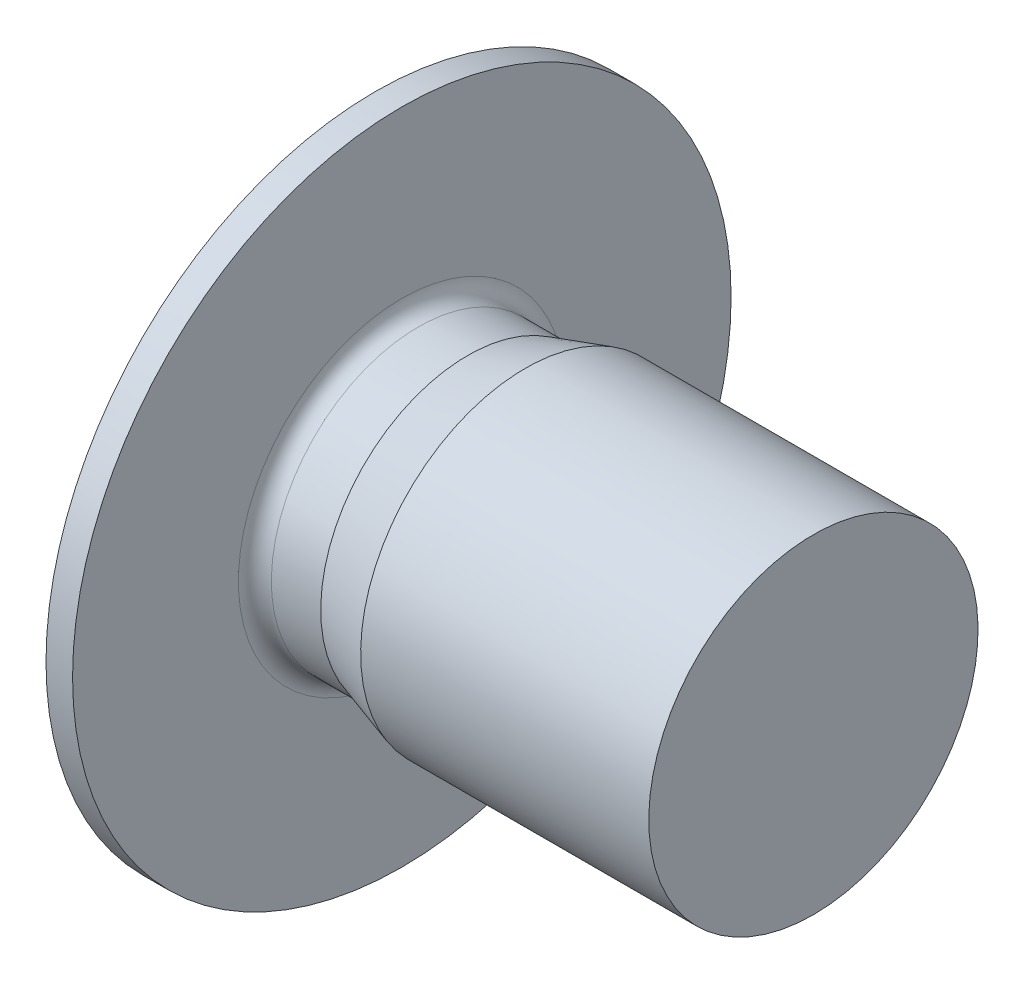
ISO-10303-21;
HEADER;
FILE_DESCRIPTION(('STEP AP214'),'2;1');
FILE_NAME('part.step','',(''),(''),'','','');
FILE_SCHEMA(('AUTOMOTIVE_DESIGN { 1 0 10303 214 1 1 1 1 }'));
ENDSEC;
DATA;
#1=APPLICATION_CONTEXT('core data for automotive mechanical design processes');
#2=APPLICATION_PROTOCOL_DEFINITION('international standard','automotive_design',2000,#1);
#3=PRODUCT_CONTEXT('',#1,'mechanical');
#4=PRODUCT('Part','Part','',(#3));
#5=PRODUCT_RELATED_PRODUCT_CATEGORY('part','',(#4));
#6=PRODUCT_DEFINITION_FORMATION('','',#4);
#7=PRODUCT_DEFINITION_CONTEXT('part definition',#1,'design');
#8=PRODUCT_DEFINITION('design','',#6,#7);
#9=PRODUCT_DEFINITION_SHAPE('','',#8);
#10=(LENGTH_UNIT() NAMED_UNIT(*) SI_UNIT(.MILLI.,.METRE.));
#11=(NAMED_UNIT(*) PLANE_ANGLE_UNIT() SI_UNIT($,.RADIAN.));
#12=(NAMED_UNIT(*) SI_UNIT($,.STERADIAN.) SOLID_ANGLE_UNIT());
#13=UNCERTAINTY_MEASURE_WITH_UNIT(LENGTH_MEASURE(1.E-05),#10,'distance_accuracy_value','');
#14=(GEOMETRIC_REPRESENTATION_CONTEXT(3) GLOBAL_UNCERTAINTY_ASSIGNED_CONTEXT((#13)) GLOBAL_UNIT_ASSIGNED_CONTEXT((#10,
#11,#12)) REPRESENTATION_CONTEXT('',''));
#15=CARTESIAN_POINT('',(0.,0.,0.));
#16=DIRECTION('',(0.,0.,1.));
#17=DIRECTION('',(1.,0.,0.));
#18=AXIS2_PLACEMENT_3D('',#15,#16,#17);
#19=CARTESIAN_POINT('',(1.6,0.,0.));
#20=DIRECTION('',(-1.,0.,0.));
#21=DIRECTION('',(0.,0.,1.));
#22=AXIS2_PLACEMENT_3D('',#19,#20,#21);
#23=PLANE('',#22);
#24=CARTESIAN_POINT('',(1.6,0.,0.));
#25=DIRECTION('',(-1.,0.,0.));
#26=DIRECTION('',(0.,-1.,0.));
#27=AXIS2_PLACEMENT_3D('',#24,#25,#26);
#28=CIRCLE('',#27,1.);
#29=CARTESIAN_POINT('',(1.6,-0.866025403784439,0.5));
#30=VERTEX_POINT('',#29);
#31=CARTESIAN_POINT('',(1.6,0.,1.));
#32=VERTEX_POINT('',#31);
#33=EDGE_CURVE('E50',#30,#32,#28,.T.);
#34=ORIENTED_EDGE('',*,*,#33,.F.);
#35=DIRECTION('',(0.,0.5,0.866025403784439));
#36=VECTOR('',#35,1.);
#37=CARTESIAN_POINT('',(1.6,-1.15470053837925,0.));
#38=LINE('',#37,#36);
#39=CARTESIAN_POINT('',(1.6,-0.577350269189627,1.));
#40=VERTEX_POINT('',#39);
#41=EDGE_CURVE('E265',#30,#40,#38,.T.);
#42=ORIENTED_EDGE('',*,*,#41,.T.);
#43=DIRECTION('',(0.,1.,0.));
#44=VECTOR('',#43,1.);
#45=CARTESIAN_POINT('',(1.6,-0.577350269189627,1.));
#46=LINE('',#45,#44);
#47=EDGE_CURVE('E233',#40,#32,#46,.T.);
#48=ORIENTED_EDGE('',*,*,#47,.T.);
#49=EDGE_LOOP('',(#34,#42,#48));
#50=FACE_BOUND('',#49,.T.);
#51=ADVANCED_FACE('F39',(#50),#23,.T.);
#52=CARTESIAN_POINT('',(1.6,0.866025403784439,0.5));
#53=VERTEX_POINT('',#52);
#54=EDGE_CURVE('E11',#32,#53,#28,.T.);
#55=ORIENTED_EDGE('',*,*,#54,.F.);
#56=CARTESIAN_POINT('',(1.6,0.577350269189626,1.));
#57=VERTEX_POINT('',#56);
#58=EDGE_CURVE('E258',#32,#57,#46,.T.);
#59=ORIENTED_EDGE('',*,*,#58,.T.);
#60=DIRECTION('',(0.,0.5,-0.866025403784439));
#61=VECTOR('',#60,1.);
#62=CARTESIAN_POINT('',(1.6,0.577350269189626,1.));
#63=LINE('',#62,#61);
#64=EDGE_CURVE('E279',#57,#53,#63,.T.);
#65=ORIENTED_EDGE('',*,*,#64,.T.);
#66=EDGE_LOOP('',(#55,#59,#65));
#67=FACE_BOUND('',#66,.T.);
#68=ADVANCED_FACE('F126',(#67),#23,.T.);
#69=CARTESIAN_POINT('',(1.6,0.866025403784439,-0.5));
#70=VERTEX_POINT('',#69);
#71=EDGE_CURVE('E48',#53,#70,#28,.T.);
#72=ORIENTED_EDGE('',*,*,#71,.F.);
#73=CARTESIAN_POINT('',(1.6,1.15470053837925,0.));
#74=VERTEX_POINT('',#73);
#75=EDGE_CURVE('E246',#53,#74,#63,.T.);
#76=ORIENTED_EDGE('',*,*,#75,.T.);
#77=DIRECTION('',(0.,-0.5,-0.866025403784439));
#78=VECTOR('',#77,1.);
#79=CARTESIAN_POINT('',(1.6,1.15470053837925,0.));
#80=LINE('',#79,#78);
#81=EDGE_CURVE('E276',#74,#70,#80,.T.);
#82=ORIENTED_EDGE('',*,*,#81,.T.);
#83=EDGE_LOOP('',(#72,#76,#82));
#84=FACE_BOUND('',#83,.T.);
#85=ADVANCED_FACE('F131',(#84),#23,.T.);
#86=CARTESIAN_POINT('',(1.6,0.,-1.));
#87=VERTEX_POINT('',#86);
#88=EDGE_CURVE('E224',#70,#87,#28,.T.);
#89=ORIENTED_EDGE('',*,*,#88,.F.);
#90=CARTESIAN_POINT('',(1.6,0.577350269189626,-1.));
#91=VERTEX_POINT('',#90);
#92=EDGE_CURVE('E278',#70,#91,#80,.T.);
#93=ORIENTED_EDGE('',*,*,#92,.T.);
#94=DIRECTION('',(0.,-1.,0.));
#95=VECTOR('',#94,1.);
#96=CARTESIAN_POINT('',(1.6,0.577350269189626,-1.));
#97=LINE('',#96,#95);
#98=EDGE_CURVE('E272',#91,#87,#97,.T.);
#99=ORIENTED_EDGE('',*,*,#98,.T.);
#100=EDGE_LOOP('',(#89,#93,#99));
#101=FACE_BOUND('',#100,.T.);
#102=ADVANCED_FACE('F190',(#101),#23,.T.);
#103=CARTESIAN_POINT('',(1.6,-0.866025403784439,-0.5));
#104=VERTEX_POINT('',#103);
#105=EDGE_CURVE('E57',#87,#104,#28,.T.);
#106=ORIENTED_EDGE('',*,*,#105,.F.);
#107=CARTESIAN_POINT('',(1.6,-0.577350269189626,-1.));
#108=VERTEX_POINT('',#107);
#109=EDGE_CURVE('E275',#87,#108,#97,.T.);
#110=ORIENTED_EDGE('',*,*,#109,.T.);
#111=DIRECTION('',(0.,-0.5,0.866025403784438));
#112=VECTOR('',#111,1.);
#113=CARTESIAN_POINT('',(1.6,-0.577350269189626,-1.));
#114=LINE('',#113,#112);
#115=EDGE_CURVE('E267',#108,#104,#114,.T.);
#116=ORIENTED_EDGE('',*,*,#115,.T.);
#117=EDGE_LOOP('',(#106,#110,#116));
#118=FACE_BOUND('',#117,.T.);
#119=ADVANCED_FACE('F124',(#118),#23,.T.);
#120=CARTESIAN_POINT('',(-0.9,0.,0.));
#121=DIRECTION('',(-1.,0.,0.));
#122=DIRECTION('',(0.,-1.,0.));
#123=AXIS2_PLACEMENT_3D('',#120,#121,#122);
#124=CYLINDRICAL_SURFACE('',#123,1.785);
#125=CARTESIAN_POINT('',(0.2,0.,0.));
#126=DIRECTION('',(-1.,0.,0.));
#127=DIRECTION('',(0.,-1.,0.));
#128=AXIS2_PLACEMENT_3D('',#125,#126,#127);
#129=CIRCLE('',#128,1.785);
#130=CARTESIAN_POINT('',(0.2,-1.785,0.));
#131=VERTEX_POINT('',#130);
#132=EDGE_CURVE('E43',#131,#131,#129,.F.);
#133=ORIENTED_EDGE('',*,*,#132,.T.);
#134=EDGE_LOOP('',(#133));
#135=FACE_BOUND('',#134,.T.);
#136=CARTESIAN_POINT('',(0.8,0.,0.));
#137=DIRECTION('',(-1.,0.,0.));
#138=DIRECTION('',(0.,-1.,0.));
#139=AXIS2_PLACEMENT_3D('',#136,#137,#138);
#140=CIRCLE('',#139,1.785);
#141=CARTESIAN_POINT('',(0.8,-1.785,0.));
#142=VERTEX_POINT('',#141);
#143=EDGE_CURVE('E197',#142,#142,#140,.T.);
#144=ORIENTED_EDGE('',*,*,#143,.T.);
#145=EDGE_LOOP('',(#144));
#146=FACE_BOUND('',#145,.T.);
#147=ADVANCED_FACE('F183',(#135,#146),#124,.T.);
#148=CARTESIAN_POINT('',(0.,4.,0.));
#149=DIRECTION('',(-1.,0.,0.));
#150=DIRECTION('',(0.,-1.,0.));
#151=AXIS2_PLACEMENT_3D('',#148,#149,#150);
#152=PLANE('',#151);
#153=CARTESIAN_POINT('',(0.,0.,0.));
#154=DIRECTION('',(-1.,0.,0.));
#155=DIRECTION('',(0.,-1.,0.));
#156=AXIS2_PLACEMENT_3D('',#153,#154,#155);
#157=CIRCLE('',#156,1.985);
#158=CARTESIAN_POINT('',(0.,-1.985,0.));
#159=VERTEX_POINT('',#158);
#160=EDGE_CURVE('E220',#159,#159,#157,.T.);
#161=ORIENTED_EDGE('',*,*,#160,.T.);
#162=EDGE_LOOP('',(#161));
#163=FACE_BOUND('',#162,.T.);
#164=CARTESIAN_POINT('',(0.,0.,0.));
#165=DIRECTION('',(-1.,0.,0.));
#166=DIRECTION('',(0.,-1.,0.));
#167=AXIS2_PLACEMENT_3D('',#164,#165,#166);
#168=CIRCLE('',#167,4.);
#169=CARTESIAN_POINT('',(0.,-4.,0.));
#170=VERTEX_POINT('',#169);
#171=EDGE_CURVE('E218',#170,#170,#168,.T.);
#172=ORIENTED_EDGE('',*,*,#171,.F.);
#173=EDGE_LOOP('',(#172));
#174=FACE_BOUND('',#173,.T.);
#175=ADVANCED_FACE('F180',(#163,#174),#152,.F.);
#176=CARTESIAN_POINT('',(-0.9,0.,0.));
#177=DIRECTION('',(-1.,0.,0.));
#178=DIRECTION('',(0.,-1.,0.));
#179=AXIS2_PLACEMENT_3D('',#176,#177,#178);
#180=CYLINDRICAL_SURFACE('',#179,4.);
#181=CARTESIAN_POINT('',(-0.322649730810382,0.,0.));
#182=DIRECTION('',(-1.,0.,0.));
#183=DIRECTION('',(0.,-1.,0.));
#184=AXIS2_PLACEMENT_3D('',#181,#182,#183);
#185=CIRCLE('',#184,4.);
#186=CARTESIAN_POINT('',(-0.322649730810381,-4.,0.));
#187=VERTEX_POINT('',#186);
#188=EDGE_CURVE('E215',#187,#187,#185,.T.);
#189=ORIENTED_EDGE('',*,*,#188,.F.);
#190=EDGE_LOOP('',(#189));
#191=FACE_BOUND('',#190,.T.);
#192=ORIENTED_EDGE('',*,*,#171,.T.);
#193=EDGE_LOOP('',(#192));
#194=FACE_BOUND('',#193,.T.);
#195=ADVANCED_FACE('F176',(#191,#194),#180,.T.);
#196=CARTESIAN_POINT('',(-0.322649730810382,0.,0.));
#197=DIRECTION('',(1.,0.,0.));
#198=DIRECTION('',(0.,1.,0.));
#199=AXIS2_PLACEMENT_3D('',#196,#197,#198);
#200=CONICAL_SURFACE('',#199,4.,1.0471975511966);
#201=CARTESIAN_POINT('',(-0.9,0.,0.));
#202=DIRECTION('',(-1.,0.,0.));
#203=DIRECTION('',(0.,-1.,0.));
#204=AXIS2_PLACEMENT_3D('',#201,#202,#203);
#205=CIRCLE('',#204,3.);
#206=CARTESIAN_POINT('',(-0.899999999999999,-3.,0.));
#207=VERTEX_POINT('',#206);
#208=EDGE_CURVE('E212',#207,#207,#205,.T.);
#209=ORIENTED_EDGE('',*,*,#208,.F.);
#210=EDGE_LOOP('',(#209));
#211=FACE_BOUND('',#210,.T.);
#212=ORIENTED_EDGE('',*,*,#188,.T.);
#213=EDGE_LOOP('',(#212));
#214=FACE_BOUND('',#213,.T.);
#215=ADVANCED_FACE('F172',(#211,#214),#200,.T.);
#216=CARTESIAN_POINT('',(-0.9,0.,0.));
#217=DIRECTION('',(1.,0.,0.));
#218=DIRECTION('',(0.,1.,0.));
#219=AXIS2_PLACEMENT_3D('',#216,#217,#218);
#220=PLANE('',#219);
#221=DIRECTION('',(0.,-0.5,-0.866025403784439));
#222=VECTOR('',#221,1.);
#223=CARTESIAN_POINT('',(-0.9,1.15470053837925,0.));
#224=LINE('',#223,#222);
#225=CARTESIAN_POINT('',(-0.9,1.15470053837925,0.));
#226=VERTEX_POINT('',#225);
#227=CARTESIAN_POINT('',(-0.9,0.577350269189626,-1.));
#228=VERTEX_POINT('',#227);
#229=EDGE_CURVE('E227',#226,#228,#224,.T.);
#230=ORIENTED_EDGE('',*,*,#229,.F.);
#231=DIRECTION('',(0.,0.5,-0.866025403784439));
#232=VECTOR('',#231,1.);
#233=CARTESIAN_POINT('',(-0.9,0.577350269189626,1.));
#234=LINE('',#233,#232);
#235=CARTESIAN_POINT('',(-0.9,0.577350269189626,1.));
#236=VERTEX_POINT('',#235);
#237=EDGE_CURVE('E65',#236,#226,#234,.T.);
#238=ORIENTED_EDGE('',*,*,#237,.F.);
#239=DIRECTION('',(0.,1.,0.));
#240=VECTOR('',#239,1.);
#241=CARTESIAN_POINT('',(-0.9,-0.577350269189627,1.));
#242=LINE('',#241,#240);
#243=CARTESIAN_POINT('',(-0.9,-0.577350269189627,1.));
#244=VERTEX_POINT('',#243);
#245=EDGE_CURVE('E244',#244,#236,#242,.T.);
#246=ORIENTED_EDGE('',*,*,#245,.F.);
#247=DIRECTION('',(0.,0.5,0.866025403784439));
#248=VECTOR('',#247,1.);
#249=CARTESIAN_POINT('',(-0.9,-1.15470053837925,0.));
#250=LINE('',#249,#248);
#251=CARTESIAN_POINT('',(-0.9,-1.15470053837925,0.));
#252=VERTEX_POINT('',#251);
#253=EDGE_CURVE('E241',#252,#244,#250,.T.);
#254=ORIENTED_EDGE('',*,*,#253,.F.);
#255=DIRECTION('',(0.,-0.5,0.866025403784438));
#256=VECTOR('',#255,1.);
#257=CARTESIAN_POINT('',(-0.9,-0.577350269189626,-1.));
#258=LINE('',#257,#256);
#259=CARTESIAN_POINT('',(-0.9,-0.577350269189626,-1.));
#260=VERTEX_POINT('',#259);
#261=EDGE_CURVE('E238',#260,#252,#258,.T.);
#262=ORIENTED_EDGE('',*,*,#261,.F.);
#263=DIRECTION('',(0.,-1.,0.));
#264=VECTOR('',#263,1.);
#265=CARTESIAN_POINT('',(-0.9,0.577350269189626,-1.));
#266=LINE('',#265,#264);
#267=EDGE_CURVE('E230',#228,#260,#266,.T.);
#268=ORIENTED_EDGE('',*,*,#267,.F.);
#269=EDGE_LOOP('',(#230,#238,#246,#254,#262,#268));
#270=FACE_BOUND('',#269,.T.);
#271=ORIENTED_EDGE('',*,*,#208,.T.);
#272=EDGE_LOOP('',(#271));
#273=FACE_BOUND('',#272,.T.);
#274=ADVANCED_FACE('F168',(#270,#273),#220,.F.);
#275=CARTESIAN_POINT('',(5.,2.,0.));
#276=DIRECTION('',(-1.,0.,0.));
#277=DIRECTION('',(0.,-1.,0.));
#278=AXIS2_PLACEMENT_3D('',#275,#276,#277);
#279=PLANE('',#278);
#280=CARTESIAN_POINT('',(5.,0.,0.));
#281=DIRECTION('',(-1.,0.,0.));
#282=DIRECTION('',(0.,-1.,0.));
#283=AXIS2_PLACEMENT_3D('',#280,#281,#282);
#284=CIRCLE('',#283,2.);
#285=CARTESIAN_POINT('',(5.,-2.,0.));
#286=VERTEX_POINT('',#285);
#287=EDGE_CURVE('E202',#286,#286,#284,.T.);
#288=ORIENTED_EDGE('',*,*,#287,.F.);
#289=EDGE_LOOP('',(#288));
#290=FACE_BOUND('',#289,.T.);
#291=ADVANCED_FACE('F164',(#290),#279,.F.);
#292=CARTESIAN_POINT('',(-0.9,0.,0.));
#293=DIRECTION('',(-1.,0.,0.));
#294=DIRECTION('',(0.,-1.,0.));
#295=AXIS2_PLACEMENT_3D('',#292,#293,#294);
#296=CYLINDRICAL_SURFACE('',#295,2.);
#297=CARTESIAN_POINT('',(1.5,0.,0.));
#298=DIRECTION('',(-1.,0.,0.));
#299=DIRECTION('',(0.,-1.,0.));
#300=AXIS2_PLACEMENT_3D('',#297,#298,#299);
#301=CIRCLE('',#300,2.);
#302=CARTESIAN_POINT('',(1.5,-2.,0.));
#303=VERTEX_POINT('',#302);
#304=EDGE_CURVE('E198',#303,#303,#301,.T.);
#305=ORIENTED_EDGE('',*,*,#304,.F.);
#306=EDGE_LOOP('',(#305));
#307=FACE_BOUND('',#306,.T.);
#308=ORIENTED_EDGE('',*,*,#287,.T.);
#309=EDGE_LOOP('',(#308));
#310=FACE_BOUND('',#309,.T.);
#311=ADVANCED_FACE('F160',(#307,#310),#296,.T.);
#312=CARTESIAN_POINT('',(1.5,0.,0.));
#313=DIRECTION('',(1.,0.,0.));
#314=DIRECTION('',(0.,1.,0.));
#315=AXIS2_PLACEMENT_3D('',#312,#313,#314);
#316=CONICAL_SURFACE('',#315,2.,0.297996923596222);
#317=ORIENTED_EDGE('',*,*,#143,.F.);
#318=EDGE_LOOP('',(#317));
#319=FACE_BOUND('',#318,.T.);
#320=ORIENTED_EDGE('',*,*,#304,.T.);
#321=EDGE_LOOP('',(#320));
#322=FACE_BOUND('',#321,.T.);
#323=ADVANCED_FACE('F157',(#319,#322),#316,.T.);
#324=CARTESIAN_POINT('',(0.2,0.,0.));
#325=DIRECTION('',(-1.,0.,0.));
#326=DIRECTION('',(0.,-1.,0.));
#327=AXIS2_PLACEMENT_3D('',#324,#325,#326);
#328=TOROIDAL_SURFACE('',#327,1.985,0.2);
#329=ORIENTED_EDGE('',*,*,#132,.F.);
#330=EDGE_LOOP('',(#329));
#331=FACE_BOUND('',#330,.T.);
#332=ORIENTED_EDGE('',*,*,#160,.F.);
#333=EDGE_LOOP('',(#332));
#334=FACE_BOUND('',#333,.T.);
#335=ADVANCED_FACE('F41',(#331,#334),#328,.F.);
#336=CARTESIAN_POINT('',(1.6,0.577350269189626,1.));
#337=DIRECTION('',(0.,0.866025403784438,0.5));
#338=DIRECTION('',(0.,-0.5,0.866025403784439));
#339=AXIS2_PLACEMENT_3D('',#336,#337,#338);
#340=PLANE('',#339);
#341=ORIENTED_EDGE('',*,*,#237,.T.);
#342=DIRECTION('',(-1.,0.,0.));
#343=VECTOR('',#342,1.);
#344=CARTESIAN_POINT('',(1.6,1.15470053837925,0.));
#345=LINE('',#344,#343);
#346=EDGE_CURVE('E207',#74,#226,#345,.T.);
#347=ORIENTED_EDGE('',*,*,#346,.F.);
#348=ORIENTED_EDGE('',*,*,#75,.F.);
#349=ORIENTED_EDGE('',*,*,#64,.F.);
#350=DIRECTION('',(-1.,0.,0.));
#351=VECTOR('',#350,1.);
#352=CARTESIAN_POINT('',(1.6,0.577350269189626,1.));
#353=LINE('',#352,#351);
#354=EDGE_CURVE('E199',#57,#236,#353,.T.);
#355=ORIENTED_EDGE('',*,*,#354,.T.);
#356=EDGE_LOOP('',(#341,#347,#348,#349,#355));
#357=FACE_BOUND('',#356,.T.);
#358=ADVANCED_FACE('F139',(#357),#340,.F.);
#359=CARTESIAN_POINT('',(1.6,-0.577350269189627,1.));
#360=DIRECTION('',(0.,0.,1.));
#361=DIRECTION('',(1.,0.,0.));
#362=AXIS2_PLACEMENT_3D('',#359,#360,#361);
#363=PLANE('',#362);
#364=ORIENTED_EDGE('',*,*,#245,.T.);
#365=ORIENTED_EDGE('',*,*,#354,.F.);
#366=ORIENTED_EDGE('',*,*,#58,.F.);
#367=ORIENTED_EDGE('',*,*,#47,.F.);
#368=DIRECTION('',(-1.,0.,0.));
#369=VECTOR('',#368,1.);
#370=CARTESIAN_POINT('',(1.6,-0.577350269189627,1.));
#371=LINE('',#370,#369);
#372=EDGE_CURVE('E204',#40,#244,#371,.T.);
#373=ORIENTED_EDGE('',*,*,#372,.T.);
#374=EDGE_LOOP('',(#364,#365,#366,#367,#373));
#375=FACE_BOUND('',#374,.T.);
#376=ADVANCED_FACE('F135',(#375),#363,.F.);
#377=CARTESIAN_POINT('',(1.6,-1.15470053837925,0.));
#378=DIRECTION('',(0.,-0.866025403784439,0.5));
#379=DIRECTION('',(0.,-0.5,-0.866025403784439));
#380=AXIS2_PLACEMENT_3D('',#377,#378,#379);
#381=PLANE('',#380);
#382=ORIENTED_EDGE('',*,*,#253,.T.);
#383=ORIENTED_EDGE('',*,*,#372,.F.);
#384=ORIENTED_EDGE('',*,*,#41,.F.);
#385=CARTESIAN_POINT('',(1.6,-1.15470053837925,0.));
#386=VERTEX_POINT('',#385);
#387=EDGE_CURVE('E260',#386,#30,#38,.T.);
#388=ORIENTED_EDGE('',*,*,#387,.F.);
#389=DIRECTION('',(-1.,0.,0.));
#390=VECTOR('',#389,1.);
#391=CARTESIAN_POINT('',(1.6,-1.15470053837925,0.));
#392=LINE('',#391,#390);
#393=EDGE_CURVE('E249',#386,#252,#392,.T.);
#394=ORIENTED_EDGE('',*,*,#393,.T.);
#395=EDGE_LOOP('',(#382,#383,#384,#388,#394));
#396=FACE_BOUND('',#395,.T.);
#397=ADVANCED_FACE('F138',(#396),#381,.F.);
#398=CARTESIAN_POINT('',(1.6,-0.577350269189626,-1.));
#399=DIRECTION('',(0.,-0.866025403784439,-0.5));
#400=DIRECTION('',(0.,0.5,-0.866025403784439));
#401=AXIS2_PLACEMENT_3D('',#398,#399,#400);
#402=PLANE('',#401);
#403=ORIENTED_EDGE('',*,*,#261,.T.);
#404=ORIENTED_EDGE('',*,*,#393,.F.);
#405=EDGE_CURVE('E271',#104,#386,#114,.T.);
#406=ORIENTED_EDGE('',*,*,#405,.F.);
#407=ORIENTED_EDGE('',*,*,#115,.F.);
#408=DIRECTION('',(-1.,0.,0.));
#409=VECTOR('',#408,1.);
#410=CARTESIAN_POINT('',(1.6,-0.577350269189626,-1.));
#411=LINE('',#410,#409);
#412=EDGE_CURVE('E251',#108,#260,#411,.T.);
#413=ORIENTED_EDGE('',*,*,#412,.T.);
#414=EDGE_LOOP('',(#403,#404,#406,#407,#413));
#415=FACE_BOUND('',#414,.T.);
#416=ADVANCED_FACE('F143',(#415),#402,.F.);
#417=CARTESIAN_POINT('',(1.6,0.577350269189626,-1.));
#418=DIRECTION('',(0.,0.,-1.));
#419=DIRECTION('',(-1.,0.,0.));
#420=AXIS2_PLACEMENT_3D('',#417,#418,#419);
#421=PLANE('',#420);
#422=ORIENTED_EDGE('',*,*,#267,.T.);
#423=ORIENTED_EDGE('',*,*,#412,.F.);
#424=ORIENTED_EDGE('',*,*,#109,.F.);
#425=ORIENTED_EDGE('',*,*,#98,.F.);
#426=DIRECTION('',(-1.,0.,0.));
#427=VECTOR('',#426,1.);
#428=CARTESIAN_POINT('',(1.6,0.577350269189626,-1.));
#429=LINE('',#428,#427);
#430=EDGE_CURVE('E252',#91,#228,#429,.T.);
#431=ORIENTED_EDGE('',*,*,#430,.T.);
#432=EDGE_LOOP('',(#422,#423,#424,#425,#431));
#433=FACE_BOUND('',#432,.T.);
#434=ADVANCED_FACE('F147',(#433),#421,.F.);
#435=CARTESIAN_POINT('',(1.6,1.15470053837925,0.));
#436=DIRECTION('',(0.,0.866025403784439,-0.5));
#437=DIRECTION('',(0.,0.5,0.866025403784439));
#438=AXIS2_PLACEMENT_3D('',#435,#436,#437);
#439=PLANE('',#438);
#440=ORIENTED_EDGE('',*,*,#229,.T.);
#441=ORIENTED_EDGE('',*,*,#430,.F.);
#442=ORIENTED_EDGE('',*,*,#92,.F.);
#443=ORIENTED_EDGE('',*,*,#81,.F.);
#444=ORIENTED_EDGE('',*,*,#346,.T.);
#445=EDGE_LOOP('',(#440,#441,#442,#443,#444));
#446=FACE_BOUND('',#445,.T.);
#447=ADVANCED_FACE('F121',(#446),#439,.F.);
#448=EDGE_CURVE('E223',#104,#30,#28,.T.);
#449=ORIENTED_EDGE('',*,*,#448,.F.);
#450=ORIENTED_EDGE('',*,*,#405,.T.);
#451=ORIENTED_EDGE('',*,*,#387,.T.);
#452=EDGE_LOOP('',(#449,#450,#451));
#453=FACE_BOUND('',#452,.T.);
#454=ADVANCED_FACE('F116',(#453),#23,.T.);
#455=CARTESIAN_POINT('',(2.20086061902756,0.,0.));
#456=DIRECTION('',(-1.,0.,0.));
#457=DIRECTION('',(0.,-1.,0.));
#458=AXIS2_PLACEMENT_3D('',#455,#456,#457);
#459=CONICAL_SURFACE('',#458,0.,1.02974425867666);
#460=ORIENTED_EDGE('',*,*,#33,.T.);
#461=ORIENTED_EDGE('',*,*,#54,.T.);
#462=ORIENTED_EDGE('',*,*,#71,.T.);
#463=ORIENTED_EDGE('',*,*,#88,.T.);
#464=ORIENTED_EDGE('',*,*,#105,.T.);
#465=ORIENTED_EDGE('',*,*,#448,.T.);
#466=EDGE_LOOP('',(#460,#461,#462,#463,#464,#465));
#467=FACE_BOUND('',#466,.T.);
#468=CARTESIAN_POINT('',(2.20086061902756,0.,0.));
#469=VERTEX_POINT('',#468);
#470=VERTEX_LOOP('',#469);
#471=FACE_BOUND('',#470,.T.);
#472=ADVANCED_FACE('F114',(#467,#471),#459,.F.);
#473=CLOSED_SHELL('',(#51,#68,#85,#102,#119,#147,#175,#195,#215,#274,#291,#311,#323,#335,#358,
#376,#397,#416,#434,#447,#454,#472));
#474=MANIFOLD_SOLID_BREP('B2',#473);
#475=ADVANCED_BREP_SHAPE_REPRESENTATION('',(#18,#474),#14);
#476=SHAPE_DEFINITION_REPRESENTATION(#9,#475);
ENDSEC;
END-ISO-10303-21;
